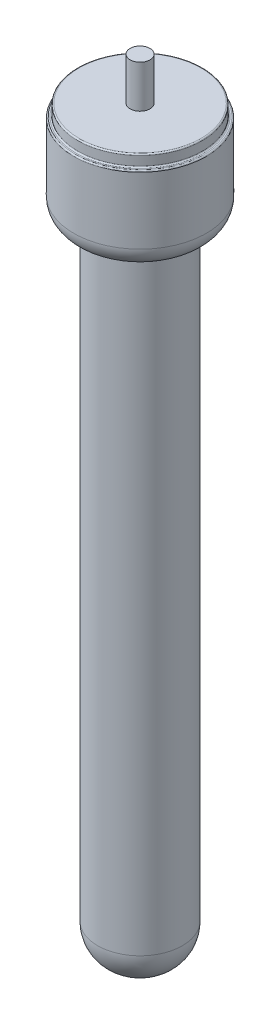
ISO-10303-21;
HEADER;
FILE_DESCRIPTION(('STEP AP214'),'2;1');
FILE_NAME('part.step','',(''),(''),'','','');
FILE_SCHEMA(('AUTOMOTIVE_DESIGN { 1 0 10303 214 1 1 1 1 }'));
ENDSEC;
DATA;
#1=APPLICATION_CONTEXT('core data for automotive mechanical design processes');
#2=APPLICATION_PROTOCOL_DEFINITION('international standard','automotive_design',2000,#1);
#3=PRODUCT_CONTEXT('',#1,'mechanical');
#4=PRODUCT('Part','Part','',(#3));
#5=PRODUCT_RELATED_PRODUCT_CATEGORY('part','',(#4));
#6=PRODUCT_DEFINITION_FORMATION('','',#4);
#7=PRODUCT_DEFINITION_CONTEXT('part definition',#1,'design');
#8=PRODUCT_DEFINITION('design','',#6,#7);
#9=PRODUCT_DEFINITION_SHAPE('','',#8);
#10=(LENGTH_UNIT() NAMED_UNIT(*) SI_UNIT(.MILLI.,.METRE.));
#11=(NAMED_UNIT(*) PLANE_ANGLE_UNIT() SI_UNIT($,.RADIAN.));
#12=(NAMED_UNIT(*) SI_UNIT($,.STERADIAN.) SOLID_ANGLE_UNIT());
#13=UNCERTAINTY_MEASURE_WITH_UNIT(LENGTH_MEASURE(1.E-05),#10,'distance_accuracy_value','');
#14=(GEOMETRIC_REPRESENTATION_CONTEXT(3) GLOBAL_UNCERTAINTY_ASSIGNED_CONTEXT((#13)) GLOBAL_UNIT_ASSIGNED_CONTEXT((#10,
#11,#12)) REPRESENTATION_CONTEXT('',''));
#15=CARTESIAN_POINT('',(0.,0.,0.));
#16=DIRECTION('',(0.,0.,1.));
#17=DIRECTION('',(1.,0.,0.));
#18=AXIS2_PLACEMENT_3D('',#15,#16,#17);
#19=CARTESIAN_POINT('',(0.,148.5,0.));
#20=DIRECTION('',(0.,-1.,0.));
#21=DIRECTION('',(0.,0.,-1.));
#22=AXIS2_PLACEMENT_3D('',#19,#20,#21);
#23=CYLINDRICAL_SURFACE('',#22,12.5);
#24=CARTESIAN_POINT('',(0.,138.05,0.));
#25=DIRECTION('',(0.,1.,0.));
#26=DIRECTION('',(0.,0.,1.));
#27=AXIS2_PLACEMENT_3D('',#24,#25,#26);
#28=CIRCLE('',#27,12.5);
#29=CARTESIAN_POINT('',(0.,138.05,12.5));
#30=VERTEX_POINT('',#29);
#31=EDGE_CURVE('E11',#30,#30,#28,.F.);
#32=ORIENTED_EDGE('',*,*,#31,.T.);
#33=EDGE_LOOP('',(#32));
#34=FACE_BOUND('',#33,.T.);
#35=CARTESIAN_POINT('',(0.,125.5,0.));
#36=DIRECTION('',(0.,-1.,0.));
#37=DIRECTION('',(0.,0.,-1.));
#38=AXIS2_PLACEMENT_3D('',#35,#36,#37);
#39=CIRCLE('',#38,12.5);
#40=CARTESIAN_POINT('',(0.,125.5,-12.5));
#41=VERTEX_POINT('',#40);
#42=EDGE_CURVE('E85',#41,#41,#39,.F.);
#43=ORIENTED_EDGE('',*,*,#42,.T.);
#44=EDGE_LOOP('',(#43));
#45=FACE_BOUND('',#44,.T.);
#46=ADVANCED_FACE('F45',(#34,#45),#23,.T.);
#47=CARTESIAN_POINT('',(0.,121.5,0.));
#48=DIRECTION('',(0.,-1.,0.));
#49=DIRECTION('',(0.,0.,-1.));
#50=AXIS2_PLACEMENT_3D('',#47,#48,#49);
#51=PLANE('',#50);
#52=CARTESIAN_POINT('',(0.,121.5,0.));
#53=DIRECTION('',(0.,-1.,0.));
#54=DIRECTION('',(0.,0.,-1.));
#55=AXIS2_PLACEMENT_3D('',#52,#53,#54);
#56=CIRCLE('',#55,8.5);
#57=CARTESIAN_POINT('',(0.,121.5,-8.5));
#58=VERTEX_POINT('',#57);
#59=EDGE_CURVE('E89',#58,#58,#56,.T.);
#60=ORIENTED_EDGE('',*,*,#59,.T.);
#61=EDGE_LOOP('',(#60));
#62=FACE_BOUND('',#61,.T.);
#63=CARTESIAN_POINT('',(0.,121.5,0.));
#64=DIRECTION('',(0.,-1.,0.));
#65=DIRECTION('',(0.,0.,-1.));
#66=AXIS2_PLACEMENT_3D('',#63,#64,#65);
#67=CIRCLE('',#66,8.);
#68=CARTESIAN_POINT('',(0.,121.5,-8.));
#69=VERTEX_POINT('',#68);
#70=EDGE_CURVE('E93',#69,#69,#67,.T.);
#71=ORIENTED_EDGE('',*,*,#70,.F.);
#72=EDGE_LOOP('',(#71));
#73=FACE_BOUND('',#72,.T.);
#74=ADVANCED_FACE('F127',(#62,#73),#51,.T.);
#75=CARTESIAN_POINT('',(0.,121.5,0.));
#76=DIRECTION('',(0.,-1.,0.));
#77=DIRECTION('',(0.,0.,-1.));
#78=AXIS2_PLACEMENT_3D('',#75,#76,#77);
#79=CYLINDRICAL_SURFACE('',#78,8.);
#80=CARTESIAN_POINT('',(0.,7.00000000000001,0.));
#81=DIRECTION('',(0.,1.,0.));
#82=DIRECTION('',(0.,0.,1.));
#83=AXIS2_PLACEMENT_3D('',#80,#81,#82);
#84=CIRCLE('',#83,8.);
#85=CARTESIAN_POINT('',(0.,7.00000000000001,8.));
#86=VERTEX_POINT('',#85);
#87=EDGE_CURVE('E77',#86,#86,#84,.T.);
#88=ORIENTED_EDGE('',*,*,#87,.T.);
#89=EDGE_LOOP('',(#88));
#90=FACE_BOUND('',#89,.T.);
#91=ORIENTED_EDGE('',*,*,#70,.T.);
#92=EDGE_LOOP('',(#91));
#93=FACE_BOUND('',#92,.T.);
#94=ADVANCED_FACE('F132',(#90,#93),#79,.T.);
#95=CARTESIAN_POINT('',(0.,0.,0.));
#96=DIRECTION('',(0.,1.,0.));
#97=DIRECTION('',(0.,0.,1.));
#98=AXIS2_PLACEMENT_3D('',#95,#96,#97);
#99=PLANE('',#98);
#100=CARTESIAN_POINT('',(0.,0.,0.));
#101=DIRECTION('',(0.,1.,0.));
#102=DIRECTION('',(0.,0.,1.));
#103=AXIS2_PLACEMENT_3D('',#100,#101,#102);
#104=CIRCLE('',#103,1.);
#105=CARTESIAN_POINT('',(0.,0.,1.));
#106=VERTEX_POINT('',#105);
#107=EDGE_CURVE('E81',#106,#106,#104,.F.);
#108=ORIENTED_EDGE('',*,*,#107,.T.);
#109=EDGE_LOOP('',(#108));
#110=FACE_BOUND('',#109,.T.);
#111=ADVANCED_FACE('F138',(#110),#99,.F.);
#112=CARTESIAN_POINT('',(0.,125.5,0.));
#113=DIRECTION('',(0.,-1.,0.));
#114=DIRECTION('',(0.,0.,-1.));
#115=AXIS2_PLACEMENT_3D('',#112,#113,#114);
#116=TOROIDAL_SURFACE('',#115,8.5,4.);
#117=ORIENTED_EDGE('',*,*,#42,.F.);
#118=EDGE_LOOP('',(#117));
#119=FACE_BOUND('',#118,.T.);
#120=ORIENTED_EDGE('',*,*,#59,.F.);
#121=EDGE_LOOP('',(#120));
#122=FACE_BOUND('',#121,.T.);
#123=ADVANCED_FACE('F140',(#119,#122),#116,.T.);
#124=CARTESIAN_POINT('',(0.,7.00000000000001,0.));
#125=DIRECTION('',(0.,1.,0.));
#126=DIRECTION('',(0.,0.,1.));
#127=AXIS2_PLACEMENT_3D('',#124,#125,#126);
#128=DEGENERATE_TOROIDAL_SURFACE('',#127,1.,7.,.T.);
#129=ORIENTED_EDGE('',*,*,#87,.F.);
#130=EDGE_LOOP('',(#129));
#131=FACE_BOUND('',#130,.T.);
#132=ORIENTED_EDGE('',*,*,#107,.F.);
#133=EDGE_LOOP('',(#132));
#134=FACE_BOUND('',#133,.T.);
#135=ADVANCED_FACE('F143',(#131,#134),#128,.T.);
#136=CARTESIAN_POINT('',(0.,138.3,0.));
#137=DIRECTION('',(0.,1.,0.));
#138=DIRECTION('',(0.,0.,1.));
#139=AXIS2_PLACEMENT_3D('',#136,#137,#138);
#140=PLANE('',#139);
#141=CARTESIAN_POINT('',(0.,138.3,0.));
#142=DIRECTION('',(0.,1.,0.));
#143=DIRECTION('',(0.,0.,1.));
#144=AXIS2_PLACEMENT_3D('',#141,#142,#143);
#145=CIRCLE('',#144,12.);
#146=CARTESIAN_POINT('',(0.,138.3,12.));
#147=VERTEX_POINT('',#146);
#148=EDGE_CURVE('E53',#147,#147,#145,.F.);
#149=ORIENTED_EDGE('',*,*,#148,.T.);
#150=EDGE_LOOP('',(#149));
#151=FACE_BOUND('',#150,.T.);
#152=CARTESIAN_POINT('',(0.,138.3,0.));
#153=DIRECTION('',(0.,1.,0.));
#154=DIRECTION('',(0.,0.,1.));
#155=AXIS2_PLACEMENT_3D('',#152,#153,#154);
#156=CIRCLE('',#155,12.25);
#157=CARTESIAN_POINT('',(0.,138.3,12.25));
#158=VERTEX_POINT('',#157);
#159=EDGE_CURVE('E58',#158,#158,#156,.T.);
#160=ORIENTED_EDGE('',*,*,#159,.T.);
#161=EDGE_LOOP('',(#160));
#162=FACE_BOUND('',#161,.T.);
#163=ADVANCED_FACE('F146',(#151,#162),#140,.T.);
#164=CARTESIAN_POINT('',(0.,138.3,0.));
#165=DIRECTION('',(0.,1.,0.));
#166=DIRECTION('',(0.,0.,1.));
#167=AXIS2_PLACEMENT_3D('',#164,#165,#166);
#168=CYLINDRICAL_SURFACE('',#167,11.75);
#169=CARTESIAN_POINT('',(0.,140.25,0.));
#170=DIRECTION('',(0.,1.,0.));
#171=DIRECTION('',(0.,0.,1.));
#172=AXIS2_PLACEMENT_3D('',#169,#170,#171);
#173=CIRCLE('',#172,11.75);
#174=CARTESIAN_POINT('',(0.,140.25,11.75));
#175=VERTEX_POINT('',#174);
#176=EDGE_CURVE('E63',#175,#175,#173,.F.);
#177=ORIENTED_EDGE('',*,*,#176,.T.);
#178=EDGE_LOOP('',(#177));
#179=FACE_BOUND('',#178,.T.);
#180=CARTESIAN_POINT('',(0.,138.55,0.));
#181=DIRECTION('',(0.,1.,0.));
#182=DIRECTION('',(0.,0.,1.));
#183=AXIS2_PLACEMENT_3D('',#180,#181,#182);
#184=CIRCLE('',#183,11.75);
#185=CARTESIAN_POINT('',(0.,138.55,11.75));
#186=VERTEX_POINT('',#185);
#187=EDGE_CURVE('E69',#186,#186,#184,.T.);
#188=ORIENTED_EDGE('',*,*,#187,.T.);
#189=EDGE_LOOP('',(#188));
#190=FACE_BOUND('',#189,.T.);
#191=ADVANCED_FACE('F157',(#179,#190),#168,.T.);
#192=CARTESIAN_POINT('',(0.,148.5,0.));
#193=DIRECTION('',(0.,1.,0.));
#194=DIRECTION('',(0.,0.,1.));
#195=AXIS2_PLACEMENT_3D('',#192,#193,#194);
#196=PLANE('',#195);
#197=CARTESIAN_POINT('',(0.,148.5,0.));
#198=DIRECTION('',(0.,1.,0.));
#199=DIRECTION('',(0.,0.,1.));
#200=AXIS2_PLACEMENT_3D('',#197,#198,#199);
#201=CIRCLE('',#200,1.875);
#202=CARTESIAN_POINT('',(0.,148.5,1.875));
#203=VERTEX_POINT('',#202);
#204=EDGE_CURVE('E98',#203,#203,#201,.T.);
#205=ORIENTED_EDGE('',*,*,#204,.T.);
#206=EDGE_LOOP('',(#205));
#207=FACE_BOUND('',#206,.T.);
#208=ADVANCED_FACE('F123',(#207),#196,.T.);
#209=CARTESIAN_POINT('',(0.,140.5,0.));
#210=DIRECTION('',(0.,1.,0.));
#211=DIRECTION('',(0.,0.,1.));
#212=AXIS2_PLACEMENT_3D('',#209,#210,#211);
#213=CYLINDRICAL_SURFACE('',#212,1.875);
#214=CARTESIAN_POINT('',(0.,140.5,0.));
#215=DIRECTION('',(0.,1.,0.));
#216=DIRECTION('',(0.,0.,1.));
#217=AXIS2_PLACEMENT_3D('',#214,#215,#216);
#218=CIRCLE('',#217,1.875);
#219=CARTESIAN_POINT('',(0.,140.5,1.875));
#220=VERTEX_POINT('',#219);
#221=EDGE_CURVE('E97',#220,#220,#218,.T.);
#222=ORIENTED_EDGE('',*,*,#221,.T.);
#223=EDGE_LOOP('',(#222));
#224=FACE_BOUND('',#223,.T.);
#225=ORIENTED_EDGE('',*,*,#204,.F.);
#226=EDGE_LOOP('',(#225));
#227=FACE_BOUND('',#226,.T.);
#228=ADVANCED_FACE('F106',(#224,#227),#213,.T.);
#229=CARTESIAN_POINT('',(0.,140.5,0.));
#230=DIRECTION('',(0.,1.,0.));
#231=DIRECTION('',(0.,0.,1.));
#232=AXIS2_PLACEMENT_3D('',#229,#230,#231);
#233=PLANE('',#232);
#234=CARTESIAN_POINT('',(0.,140.5,0.));
#235=DIRECTION('',(0.,1.,0.));
#236=DIRECTION('',(0.,0.,1.));
#237=AXIS2_PLACEMENT_3D('',#234,#235,#236);
#238=CIRCLE('',#237,11.5);
#239=CARTESIAN_POINT('',(0.,140.5,11.5));
#240=VERTEX_POINT('',#239);
#241=EDGE_CURVE('E73',#240,#240,#238,.T.);
#242=ORIENTED_EDGE('',*,*,#241,.T.);
#243=EDGE_LOOP('',(#242));
#244=FACE_BOUND('',#243,.T.);
#245=ORIENTED_EDGE('',*,*,#221,.F.);
#246=EDGE_LOOP('',(#245));
#247=FACE_BOUND('',#246,.T.);
#248=ADVANCED_FACE('F109',(#244,#247),#233,.T.);
#249=CARTESIAN_POINT('',(0.,140.25,0.));
#250=DIRECTION('',(0.,1.,0.));
#251=DIRECTION('',(0.,0.,1.));
#252=AXIS2_PLACEMENT_3D('',#249,#250,#251);
#253=TOROIDAL_SURFACE('',#252,11.5,0.25);
#254=ORIENTED_EDGE('',*,*,#176,.F.);
#255=EDGE_LOOP('',(#254));
#256=FACE_BOUND('',#255,.T.);
#257=ORIENTED_EDGE('',*,*,#241,.F.);
#258=EDGE_LOOP('',(#257));
#259=FACE_BOUND('',#258,.T.);
#260=ADVANCED_FACE('F111',(#256,#259),#253,.T.);
#261=CARTESIAN_POINT('',(0.,138.55,0.));
#262=DIRECTION('',(0.,1.,0.));
#263=DIRECTION('',(0.,0.,1.));
#264=AXIS2_PLACEMENT_3D('',#261,#262,#263);
#265=TOROIDAL_SURFACE('',#264,12.,0.25);
#266=ORIENTED_EDGE('',*,*,#148,.F.);
#267=EDGE_LOOP('',(#266));
#268=FACE_BOUND('',#267,.T.);
#269=ORIENTED_EDGE('',*,*,#187,.F.);
#270=EDGE_LOOP('',(#269));
#271=FACE_BOUND('',#270,.T.);
#272=ADVANCED_FACE('F119',(#268,#271),#265,.F.);
#273=CARTESIAN_POINT('',(0.,138.05,0.));
#274=DIRECTION('',(0.,1.,0.));
#275=DIRECTION('',(0.,0.,1.));
#276=AXIS2_PLACEMENT_3D('',#273,#274,#275);
#277=TOROIDAL_SURFACE('',#276,12.25,0.25);
#278=ORIENTED_EDGE('',*,*,#31,.F.);
#279=EDGE_LOOP('',(#278));
#280=FACE_BOUND('',#279,.T.);
#281=ORIENTED_EDGE('',*,*,#159,.F.);
#282=EDGE_LOOP('',(#281));
#283=FACE_BOUND('',#282,.T.);
#284=ADVANCED_FACE('F47',(#280,#283),#277,.T.);
#285=CLOSED_SHELL('',(#46,#74,#94,#111,#123,#135,#163,#191,#208,#228,#248,#260,#272,#284));
#286=MANIFOLD_SOLID_BREP('B2',#285);
#287=ADVANCED_BREP_SHAPE_REPRESENTATION('',(#18,#286),#14);
#288=SHAPE_DEFINITION_REPRESENTATION(#9,#287);
ENDSEC;
END-ISO-10303-21;
